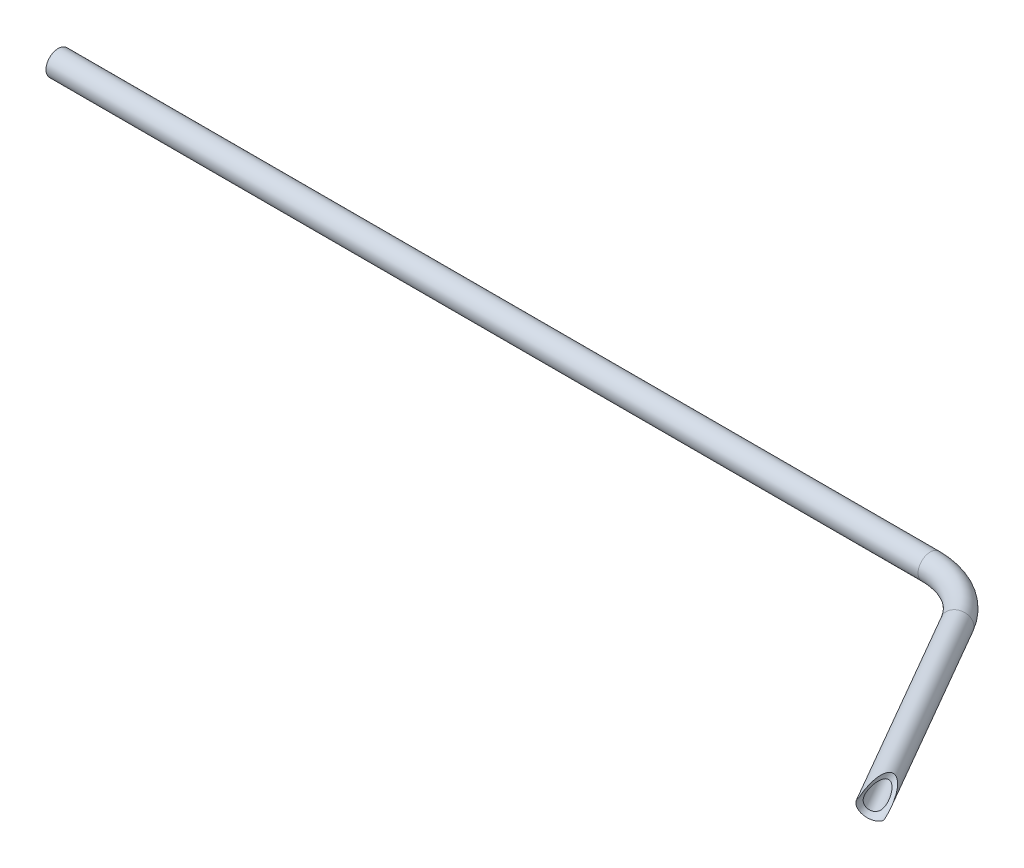
ISO-10303-21;
HEADER;
FILE_DESCRIPTION(('STEP AP214'),'2;1');
FILE_NAME('part.step','',(''),(''),'','','');
FILE_SCHEMA(('AUTOMOTIVE_DESIGN { 1 0 10303 214 1 1 1 1 }'));
ENDSEC;
DATA;
#1=APPLICATION_CONTEXT('core data for automotive mechanical design processes');
#2=APPLICATION_PROTOCOL_DEFINITION('international standard','automotive_design',2000,#1);
#3=PRODUCT_CONTEXT('',#1,'mechanical');
#4=PRODUCT('Part','Part','',(#3));
#5=PRODUCT_RELATED_PRODUCT_CATEGORY('part','',(#4));
#6=PRODUCT_DEFINITION_FORMATION('','',#4);
#7=PRODUCT_DEFINITION_CONTEXT('part definition',#1,'design');
#8=PRODUCT_DEFINITION('design','',#6,#7);
#9=PRODUCT_DEFINITION_SHAPE('','',#8);
#10=(LENGTH_UNIT() NAMED_UNIT(*) SI_UNIT(.MILLI.,.METRE.));
#11=(NAMED_UNIT(*) PLANE_ANGLE_UNIT() SI_UNIT($,.RADIAN.));
#12=(NAMED_UNIT(*) SI_UNIT($,.STERADIAN.) SOLID_ANGLE_UNIT());
#13=UNCERTAINTY_MEASURE_WITH_UNIT(LENGTH_MEASURE(1.E-05),#10,'distance_accuracy_value','');
#14=(GEOMETRIC_REPRESENTATION_CONTEXT(3) GLOBAL_UNCERTAINTY_ASSIGNED_CONTEXT((#13)) GLOBAL_UNIT_ASSIGNED_CONTEXT((#10,
#11,#12)) REPRESENTATION_CONTEXT('',''));
#15=CARTESIAN_POINT('',(0.,0.,0.));
#16=DIRECTION('',(0.,0.,1.));
#17=DIRECTION('',(1.,0.,0.));
#18=AXIS2_PLACEMENT_3D('',#15,#16,#17);
#19=CARTESIAN_POINT('',(0.,0.,0.));
#20=DIRECTION('',(1.,0.,0.));
#21=DIRECTION('',(0.,0.,-1.));
#22=AXIS2_PLACEMENT_3D('',#19,#20,#21);
#23=CYLINDRICAL_SURFACE('',#22,50.);
#24=CARTESIAN_POINT('',(3561.78262530607,0.,0.));
#25=DIRECTION('',(1.,0.,0.));
#26=DIRECTION('',(0.,0.,-1.));
#27=AXIS2_PLACEMENT_3D('',#24,#25,#26);
#28=CIRCLE('',#27,50.);
#29=CARTESIAN_POINT('',(3561.78262530607,0.,-49.9999999999999));
#30=VERTEX_POINT('',#29);
#31=EDGE_CURVE('E62',#30,#30,#28,.T.);
#32=ORIENTED_EDGE('',*,*,#31,.F.);
#33=EDGE_LOOP('',(#32));
#34=FACE_BOUND('',#33,.T.);
#35=CARTESIAN_POINT('',(0.,0.,0.));
#36=DIRECTION('',(1.,0.,0.));
#37=DIRECTION('',(0.,0.,-1.));
#38=AXIS2_PLACEMENT_3D('',#35,#36,#37);
#39=CIRCLE('',#38,50.);
#40=CARTESIAN_POINT('',(0.,0.,-50.));
#41=VERTEX_POINT('',#40);
#42=EDGE_CURVE('E71',#41,#41,#39,.T.);
#43=ORIENTED_EDGE('',*,*,#42,.T.);
#44=EDGE_LOOP('',(#43));
#45=FACE_BOUND('',#44,.T.);
#46=ADVANCED_FACE('F33',(#34,#45),#23,.T.);
#47=CARTESIAN_POINT('',(3561.78262530607,0.,300.));
#48=DIRECTION('',(0.,-1.,0.));
#49=DIRECTION('',(0.,0.,-1.));
#50=AXIS2_PLACEMENT_3D('',#47,#48,#49);
#51=TOROIDAL_SURFACE('',#50,300.,50.);
#52=CARTESIAN_POINT('',(3821.5902464414,0.,150.000000000001));
#53=DIRECTION('',(0.499999999999998,0.,0.86602540378444));
#54=DIRECTION('',(0.86602540378444,0.,-0.499999999999998));
#55=AXIS2_PLACEMENT_3D('',#52,#53,#54);
#56=CIRCLE('',#55,50.);
#57=CARTESIAN_POINT('',(3864.89151663063,0.,125.000000000001));
#58=VERTEX_POINT('',#57);
#59=EDGE_CURVE('E65',#58,#58,#56,.T.);
#60=CARTESIAN_POINT('',(3561.78262530607,0.,300.));
#61=DIRECTION('',(0.,-1.,0.));
#62=DIRECTION('',(0.,0.,-1.));
#63=AXIS2_PLACEMENT_3D('',#60,#61,#62);
#64=CIRCLE('',#63,350.);
#65=EDGE_CURVE('',#30,#58,#64,.T.);
#66=ORIENTED_EDGE('',*,*,#31,.T.);
#67=ORIENTED_EDGE('',*,*,#59,.F.);
#68=ORIENTED_EDGE('',*,*,#65,.T.);
#69=ORIENTED_EDGE('',*,*,#65,.F.);
#70=EDGE_LOOP('',(#66,#68,#67,#69));
#71=FACE_BOUND('',#70,.T.);
#72=ADVANCED_FACE('F78',(#71),#51,.T.);
#73=CARTESIAN_POINT('',(3821.5902464414,0.,150.000000000001));
#74=DIRECTION('',(0.499999999999998,0.,0.86602540378444));
#75=DIRECTION('',(0.86602540378444,0.,-0.499999999999998));
#76=AXIS2_PLACEMENT_3D('',#73,#74,#75);
#77=CYLINDRICAL_SURFACE('',#76,50.);
#78=CARTESIAN_POINT('',(4300.,-1.23165366794353E-13,978.630000000001));
#79=DIRECTION('',(0.710226827921264,0.703963727949918,-0.00359480621921086));
#80=DIRECTION('',(0.267094040751663,-0.264738685232534,0.926592791865066));
#81=AXIS2_PLACEMENT_3D('',#78,#79,#80);
#82=ELLIPSE('',#81,142.045365584253,50.);
#83=CARTESIAN_POINT('',(4332.56680158904,-32.9525605329934,959.827548335925));
#84=VERTEX_POINT('',#83);
#85=CARTESIAN_POINT('',(4267.43319841096,32.9525605329909,997.432451664075));
#86=VERTEX_POINT('',#85);
#87=EDGE_CURVE('E54',#84,#86,#82,.T.);
#88=ORIENTED_EDGE('',*,*,#87,.F.);
#89=CARTESIAN_POINT('',(4300.,-1.23165366794353E-13,978.630000000001));
#90=DIRECTION('',(0.267094040751663,-0.264738685232534,0.926592791865066));
#91=DIRECTION('',(0.710226827921264,0.703963727949918,-0.00359480621921086));
#92=AXIS2_PLACEMENT_3D('',#89,#90,#91);
#93=ELLIPSE('',#92,53.4188081503329,50.);
#94=EDGE_CURVE('E56',#86,#84,#93,.T.);
#95=ORIENTED_EDGE('',*,*,#94,.F.);
#96=EDGE_LOOP('',(#88,#95));
#97=FACE_BOUND('',#96,.T.);
#98=ORIENTED_EDGE('',*,*,#59,.T.);
#99=EDGE_LOOP('',(#98));
#100=FACE_BOUND('',#99,.T.);
#101=ADVANCED_FACE('F35',(#97,#100),#77,.T.);
#102=CARTESIAN_POINT('',(0.,0.,0.));
#103=DIRECTION('',(1.,0.,0.));
#104=DIRECTION('',(0.,0.,-1.));
#105=AXIS2_PLACEMENT_3D('',#102,#103,#104);
#106=PLANE('',#105);
#107=CARTESIAN_POINT('',(0.,0.,0.));
#108=DIRECTION('',(1.,0.,0.));
#109=DIRECTION('',(0.,0.,-1.));
#110=AXIS2_PLACEMENT_3D('',#107,#108,#109);
#111=CIRCLE('',#110,35.);
#112=CARTESIAN_POINT('',(0.,0.,-35.));
#113=VERTEX_POINT('',#112);
#114=EDGE_CURVE('E68',#113,#113,#111,.F.);
#115=ORIENTED_EDGE('',*,*,#114,.F.);
#116=EDGE_LOOP('',(#115));
#117=FACE_BOUND('',#116,.T.);
#118=ORIENTED_EDGE('',*,*,#42,.F.);
#119=EDGE_LOOP('',(#118));
#120=FACE_BOUND('',#119,.T.);
#121=ADVANCED_FACE('F88',(#117,#120),#106,.F.);
#122=CARTESIAN_POINT('',(0.,0.,0.));
#123=DIRECTION('',(1.,0.,0.));
#124=DIRECTION('',(0.,0.,-1.));
#125=AXIS2_PLACEMENT_3D('',#122,#123,#124);
#126=CYLINDRICAL_SURFACE('',#125,35.);
#127=CARTESIAN_POINT('',(3561.78262530607,0.,0.));
#128=DIRECTION('',(1.,0.,0.));
#129=DIRECTION('',(0.,0.,-1.));
#130=AXIS2_PLACEMENT_3D('',#127,#128,#129);
#131=CIRCLE('',#130,35.);
#132=CARTESIAN_POINT('',(3561.78262530607,0.,-35.));
#133=VERTEX_POINT('',#132);
#134=EDGE_CURVE('E47',#133,#133,#131,.F.);
#135=ORIENTED_EDGE('',*,*,#134,.F.);
#136=EDGE_LOOP('',(#135));
#137=FACE_BOUND('',#136,.T.);
#138=ORIENTED_EDGE('',*,*,#114,.T.);
#139=EDGE_LOOP('',(#138));
#140=FACE_BOUND('',#139,.T.);
#141=ADVANCED_FACE('F90',(#137,#140),#126,.F.);
#142=CARTESIAN_POINT('',(3561.78262530607,0.,300.));
#143=DIRECTION('',(0.,-1.,0.));
#144=DIRECTION('',(0.,0.,-1.));
#145=AXIS2_PLACEMENT_3D('',#142,#143,#144);
#146=TOROIDAL_SURFACE('',#145,300.,35.);
#147=CARTESIAN_POINT('',(3821.5902464414,0.,150.000000000001));
#148=DIRECTION('',(0.499999999999998,0.,0.86602540378444));
#149=DIRECTION('',(0.86602540378444,0.,-0.499999999999998));
#150=AXIS2_PLACEMENT_3D('',#147,#148,#149);
#151=CIRCLE('',#150,35.);
#152=CARTESIAN_POINT('',(3851.90113557386,0.,132.500000000001));
#153=VERTEX_POINT('',#152);
#154=EDGE_CURVE('E11',#153,#153,#151,.F.);
#155=CARTESIAN_POINT('',(3561.78262530607,0.,300.));
#156=DIRECTION('',(0.,-1.,0.));
#157=DIRECTION('',(0.,0.,-1.));
#158=AXIS2_PLACEMENT_3D('',#155,#156,#157);
#159=CIRCLE('',#158,335.);
#160=EDGE_CURVE('',#133,#153,#159,.T.);
#161=ORIENTED_EDGE('',*,*,#134,.T.);
#162=ORIENTED_EDGE('',*,*,#154,.F.);
#163=ORIENTED_EDGE('',*,*,#160,.T.);
#164=ORIENTED_EDGE('',*,*,#160,.F.);
#165=EDGE_LOOP('',(#161,#163,#162,#164));
#166=FACE_BOUND('',#165,.T.);
#167=ADVANCED_FACE('F97',(#166),#146,.F.);
#168=CARTESIAN_POINT('',(3821.5902464414,0.,150.000000000001));
#169=DIRECTION('',(0.499999999999998,0.,0.86602540378444));
#170=DIRECTION('',(0.86602540378444,0.,-0.499999999999998));
#171=AXIS2_PLACEMENT_3D('',#168,#169,#170);
#172=CYLINDRICAL_SURFACE('',#171,35.);
#173=CARTESIAN_POINT('',(4284.88946896214,0.,882.457792513082));
#174=CARTESIAN_POINT('',(4285.19683738173,-0.415963917673514,882.990171028531));
#175=CARTESIAN_POINT('',(4285.49871329565,-0.829186246528709,883.527852879587));
#176=CARTESIAN_POINT('',(4286.09158456451,-1.65060363470133,884.612975134687));
#177=CARTESIAN_POINT('',(4286.38257965562,-2.05879857195754,885.16041577488));
#178=CARTESIAN_POINT('',(4287.23936228283,-3.27654859534066,886.816313887177));
#179=CARTESIAN_POINT('',(4287.78891604266,-4.07922683551115,887.938293450928));
#180=CARTESIAN_POINT('',(4288.84465792513,-5.67003321300662,890.214348354848));
#181=CARTESIAN_POINT('',(4289.3508026254,-6.45814617653176,891.368454337775));
#182=CARTESIAN_POINT('',(4290.31741518861,-8.02182273900168,893.703890668888));
#183=CARTESIAN_POINT('',(4290.7778854766,-8.79738700237807,894.885219567585));
#184=CARTESIAN_POINT('',(4291.64839942914,-10.3354235823483,897.267202917483));
#185=CARTESIAN_POINT('',(4292.05864131131,-11.097936424329,898.467758767304));
#186=CARTESIAN_POINT('',(4292.8264918106,-12.6155128414943,900.89050862131));
#187=CARTESIAN_POINT('',(4293.18409578741,-13.3705757544595,902.112704522557));
#188=CARTESIAN_POINT('',(4293.67600604917,-14.4985177483642,903.959609074455));
#189=CARTESIAN_POINT('',(4293.83248736759,-14.8735209189809,904.577173799518));
#190=CARTESIAN_POINT('',(4294.12969440401,-15.6223310264893,905.816793563392));
#191=CARTESIAN_POINT('',(4294.27042067348,-15.9961380048057,906.438848444223));
#192=CARTESIAN_POINT('',(4294.53494542802,-16.7426548633127,907.687039557222));
#193=CARTESIAN_POINT('',(4294.65874714878,-17.1153649398431,908.313174985207));
#194=CARTESIAN_POINT('',(4294.88811280626,-17.8598553446211,909.569299179703));
#195=CARTESIAN_POINT('',(4294.99367775767,-18.2316357234619,910.199287729805));
#196=CARTESIAN_POINT('',(4295.16284105232,-18.8881754330785,911.316231509593));
#197=CARTESIAN_POINT('',(4295.2304939868,-19.1731161834971,911.80246763018));
#198=CARTESIAN_POINT('',(4295.35334826869,-19.7424493737099,912.776815932774));
#199=CARTESIAN_POINT('',(4295.40855003825,-20.0268418317692,913.264928050606));
#200=CARTESIAN_POINT('',(4295.50564058112,-20.5950247373555,914.242832351234));
#201=CARTESIAN_POINT('',(4295.5475294463,-20.8788151890236,914.732624522413));
#202=CARTESIAN_POINT('',(4295.61703835492,-21.4456690010128,915.713634927942));
#203=CARTESIAN_POINT('',(4295.64465825011,-21.7287323537495,916.204853177055));
#204=CARTESIAN_POINT('',(4295.7046107893,-22.5769752983459,917.680915992304));
#205=CARTESIAN_POINT('',(4295.71397476569,-23.1408617790182,918.66757312423));
#206=CARTESIAN_POINT('',(4295.66211310737,-24.2627315212162,920.642765096692));
#207=CARTESIAN_POINT('',(4295.6008850195,-24.8207145769108,921.631300001291));
#208=CARTESIAN_POINT('',(4295.4474639524,-25.6540920336222,923.11985319385));
#209=CARTESIAN_POINT('',(4295.38534088438,-25.9334113333718,923.620858244742));
#210=CARTESIAN_POINT('',(4295.23876626672,-26.4885025953554,924.621540959664));
#211=CARTESIAN_POINT('',(4295.15431706928,-26.7642749280743,925.121218757929));
#212=CARTESIAN_POINT('',(4294.9616694724,-27.3113417682666,926.118601296749));
#213=CARTESIAN_POINT('',(4294.85346618162,-27.5826353411046,926.616305609412));
#214=CARTESIAN_POINT('',(4294.61200869223,-28.1194314107043,927.608688819868));
#215=CARTESIAN_POINT('',(4294.47875795419,-28.3849347018047,928.10336812586));
#216=CARTESIAN_POINT('',(4294.18643728254,-28.9079937505313,929.087357902432));
#217=CARTESIAN_POINT('',(4294.02744309346,-29.165570262427,929.576679758668));
#218=CARTESIAN_POINT('',(4293.6824139432,-29.6719424596754,930.550348359788));
#219=CARTESIAN_POINT('',(4293.49637843128,-29.9207379660622,931.03469500313));
#220=CARTESIAN_POINT('',(4293.09669442081,-30.4076264960897,931.997109661792));
#221=CARTESIAN_POINT('',(4292.8830565567,-30.6457235941706,932.475180017457));
#222=CARTESIAN_POINT('',(4292.4279023901,-31.1093049295326,933.424024358798));
#223=CARTESIAN_POINT('',(4292.18638880896,-31.3347903948353,933.894799051629));
#224=CARTESIAN_POINT('',(4291.55737150505,-31.8720956157924,935.044003994489));
#225=CARTESIAN_POINT('',(4291.1540165277,-32.1755997230484,935.717749980799));
#226=CARTESIAN_POINT('',(4290.29030850535,-32.7446784405272,937.04421194585));
#227=CARTESIAN_POINT('',(4289.82996396376,-33.0102586966584,937.696931043737));
#228=CARTESIAN_POINT('',(4288.85648240192,-33.4975457529358,938.979442855372));
#229=CARTESIAN_POINT('',(4288.34332407384,-33.719234738746,939.609226175794));
#230=CARTESIAN_POINT('',(4287.27053682493,-34.1133065049343,940.844181129028));
#231=CARTESIAN_POINT('',(4286.71090544052,-34.2856866692457,941.449351454544));
#232=CARTESIAN_POINT('',(4285.55376258525,-34.5766080689368,942.633278005229));
#233=CARTESIAN_POINT('',(4284.95633490933,-34.6952639525635,943.212088084894));
#234=CARTESIAN_POINT('',(4283.73033658619,-34.8762478472124,944.344930344153));
#235=CARTESIAN_POINT('',(4283.10176597306,-34.9385759198753,944.898962550862));
#236=CARTESIAN_POINT('',(4281.82106121246,-35.0049536692425,945.983254724249));
#237=CARTESIAN_POINT('',(4281.16891704319,-35.0089782602181,946.513504360398));
#238=CARTESIAN_POINT('',(4279.84889207598,-34.9576316529484,947.551015040414));
#239=CARTESIAN_POINT('',(4279.18101066084,-34.9022581213502,948.058275180362));
#240=CARTESIAN_POINT('',(4277.80093973286,-34.7272636647771,949.077221590569));
#241=CARTESIAN_POINT('',(4277.08828044853,-34.6043877222867,949.587712940665));
#242=CARTESIAN_POINT('',(4275.6611163112,-34.2927447339436,950.58543841388));
#243=CARTESIAN_POINT('',(4274.94661141284,-34.1039760531557,951.072671959584));
#244=CARTESIAN_POINT('',(4273.52267067243,-33.6614398311434,952.024725310794));
#245=CARTESIAN_POINT('',(4272.8132355941,-33.4076627006663,952.489541797579));
#246=CARTESIAN_POINT('',(4271.40591765413,-32.8365290352426,953.397083497343));
#247=CARTESIAN_POINT('',(4270.70803523508,-32.5191700704117,953.839807865227));
#248=CARTESIAN_POINT('',(4269.27458508038,-31.7948709012419,954.737615494938));
#249=CARTESIAN_POINT('',(4268.54045464655,-31.382802832507,955.190865356469));
#250=CARTESIAN_POINT('',(4267.09899317672,-30.4894081027458,956.071003193042));
#251=CARTESIAN_POINT('',(4266.39166350449,-30.0080779232699,956.497889827281));
#252=CARTESIAN_POINT('',(4265.00955163797,-28.9793268536813,957.324202246759));
#253=CARTESIAN_POINT('',(4264.33477497751,-28.4318947816211,957.723623367883));
#254=CARTESIAN_POINT('',(4263.02305307496,-27.2747022122839,958.493210943404));
#255=CARTESIAN_POINT('',(4262.38610792358,-26.6649415655543,958.863377327652));
#256=CARTESIAN_POINT('',(4261.13946676427,-25.3716080984601,959.580861650852));
#257=CARTESIAN_POINT('',(4260.53081350188,-24.6865983047237,959.927402649021));
#258=CARTESIAN_POINT('',(4259.36186329109,-23.26032570063,960.584456784411));
#259=CARTESIAN_POINT('',(4258.80156740422,-22.5190616560522,960.894969130785));
#260=CARTESIAN_POINT('',(4257.73246883946,-20.9854883292057,961.476437697789));
#261=CARTESIAN_POINT('',(4257.22367198247,-20.1931732932037,961.74738944844));
#262=CARTESIAN_POINT('',(4256.25999119813,-18.5632944524712,962.24555827702));
#263=CARTESIAN_POINT('',(4255.80510700167,-17.725730873641,962.472775573265));
#264=CARTESIAN_POINT('',(4254.95064235136,-16.0113915824537,962.878784100743));
#265=CARTESIAN_POINT('',(4254.55106982521,-15.134610272885,963.057568393686));
#266=CARTESIAN_POINT('',(4253.80781576416,-13.348600339102,963.361357006035));
#267=CARTESIAN_POINT('',(4253.46413481443,-12.4393713752865,963.486360762388));
#268=CARTESIAN_POINT('',(4252.8321454263,-10.5956453837808,963.676728662446));
#269=CARTESIAN_POINT('',(4252.54384178877,-9.66114617331808,963.742087637152));
#270=CARTESIAN_POINT('',(4252.02105999276,-7.77493029321198,963.806836218701));
#271=CARTESIAN_POINT('',(4251.78658009259,-6.8232141817675,963.806227960487));
#272=CARTESIAN_POINT('',(4251.37437730485,-4.9375468848431,963.73356025383));
#273=CARTESIAN_POINT('',(4251.19527639092,-4.00382260741316,963.663457270362));
#274=CARTESIAN_POINT('',(4250.88163346843,-2.1373570453731,963.44896198415));
#275=CARTESIAN_POINT('',(4250.7470904316,-1.204615738574,963.304571395954));
#276=CARTESIAN_POINT('',(4250.51783854252,0.648944599800562,962.936858045086));
#277=CARTESIAN_POINT('',(4250.42307862546,1.56977743546017,962.713637149598));
#278=CARTESIAN_POINT('',(4250.2672383732,3.39045524597624,962.185019475864));
#279=CARTESIAN_POINT('',(4250.20615437963,4.2903024904167,961.879631629149));
#280=CARTESIAN_POINT('',(4250.11522071373,5.97976094668314,961.217045646419));
#281=CARTESIAN_POINT('',(4250.08306590364,6.77203287351613,960.866925332464));
#282=CARTESIAN_POINT('',(4250.0358349706,8.32386995236461,960.099659890693));
#283=CARTESIAN_POINT('',(4250.02075720641,9.08343824069371,959.682521208244));
#284=CARTESIAN_POINT('',(4250.00257394291,10.5643834402823,958.784875857773));
#285=CARTESIAN_POINT('',(4249.9994705151,11.285753722191,958.304358240381));
#286=CARTESIAN_POINT('',(4250.00067360725,12.6864264103097,957.285362437335));
#287=CARTESIAN_POINT('',(4250.00498114517,13.3657230239705,956.746876298608));
#288=CARTESIAN_POINT('',(4250.01504206481,14.4405782279171,955.824282057207));
#289=CARTESIAN_POINT('',(4250.01969717182,14.8493555538047,955.45539277764));
#290=CARTESIAN_POINT('',(4250.02974719998,15.649016836195,954.69864656816));
#291=CARTESIAN_POINT('',(4250.035142169,16.0398996321664,954.310788411403));
#292=CARTESIAN_POINT('',(4250.04605317781,16.8038944897913,953.51785452056));
#293=CARTESIAN_POINT('',(4250.05156923798,17.1770035225981,953.112775874011));
#294=CARTESIAN_POINT('',(4250.06225835149,17.9057435680447,952.287156241375));
#295=CARTESIAN_POINT('',(4250.06743136456,18.2613725281938,951.866613449594));
#296=CARTESIAN_POINT('',(4250.08190693704,19.3038348836183,950.582899673669));
#297=CARTESIAN_POINT('',(4250.09014754302,19.9651131984246,949.698829010692));
#298=CARTESIAN_POINT('',(4250.10232841479,21.2243611928009,947.887122045654));
#299=CARTESIAN_POINT('',(4250.10626865131,21.822330441477,946.959485447136));
#300=CARTESIAN_POINT('',(4250.10954820242,22.901246653177,945.168965542906));
#301=CARTESIAN_POINT('',(4250.10932667249,23.3878894681437,944.309493113794));
#302=CARTESIAN_POINT('',(4250.10578922888,24.3194827051429,942.568135229844));
#303=CARTESIAN_POINT('',(4250.10247273624,24.7644253094774,941.686245611607));
#304=CARTESIAN_POINT('',(4250.09349603315,25.6166505416695,939.903722719603));
#305=CARTESIAN_POINT('',(4250.08783404874,26.023904378764,939.003075749909));
#306=CARTESIAN_POINT('',(4250.0751060733,26.8037304804899,937.187011652009));
#307=CARTESIAN_POINT('',(4250.06804015631,27.1763045727855,936.271595305154));
#308=CARTESIAN_POINT('',(4250.05349838499,27.8917517608779,934.423209094585));
#309=CARTESIAN_POINT('',(4250.04602040476,28.2344415133873,933.490168513641));
#310=CARTESIAN_POINT('',(4250.03179488342,28.8901792141498,931.613749703954));
#311=CARTESIAN_POINT('',(4250.02504734465,29.2032270676512,930.670371442175));
#312=CARTESIAN_POINT('',(4250.0134113937,29.8015682709442,928.775369607505));
#313=CARTESIAN_POINT('',(4250.00852207927,30.0868750401161,927.823750266204));
#314=CARTESIAN_POINT('',(4250.00173484674,30.6315480655611,925.913074352606));
#315=CARTESIAN_POINT('',(4249.9998370485,30.8909132820345,924.954017483854));
#316=CARTESIAN_POINT('',(4250.00014918053,31.3341752322812,923.227339196293));
#317=CARTESIAN_POINT('',(4250.00159507295,31.5226272683816,922.460881692945));
#318=CARTESIAN_POINT('',(4250.00768977305,31.8844218281176,920.924405171264));
#319=CARTESIAN_POINT('',(4250.01233864028,32.0577640708119,920.154386086989));
#320=CARTESIAN_POINT('',(4250.02544031079,32.3897037063014,918.611147223689));
#321=CARTESIAN_POINT('',(4250.03389341513,32.5482999309499,917.837927196152));
#322=CARTESIAN_POINT('',(4250.05522321766,32.850970516386,916.2886952686));
#323=CARTESIAN_POINT('',(4250.06810000235,32.9950445931115,915.512683314281));
#324=CARTESIAN_POINT('',(4250.09894573709,33.2689984379653,913.9570195063));
#325=CARTESIAN_POINT('',(4250.11692253641,33.3988558954099,913.177363878255));
#326=CARTESIAN_POINT('',(4250.15864131344,33.64412376354,911.615937764337));
#327=CARTESIAN_POINT('',(4250.1823832752,33.7595342141747,910.834167284318));
#328=CARTESIAN_POINT('',(4250.23635495294,33.9757891357298,909.268879977708));
#329=CARTESIAN_POINT('',(4250.26658430164,34.0766344307281,908.485363252467));
#330=CARTESIAN_POINT('',(4250.33430844878,34.2635296701367,906.916897773657));
#331=CARTESIAN_POINT('',(4250.37180305114,34.3495800137381,906.131949059303));
#332=CARTESIAN_POINT('',(4250.45462849514,34.5060066454043,904.566150303434));
#333=CARTESIAN_POINT('',(4250.49990593452,34.5764827208131,903.785307440521));
#334=CARTESIAN_POINT('',(4250.59937174574,34.701983406434,902.22296881104));
#335=CARTESIAN_POINT('',(4250.653559798,34.7570085705986,901.441473068888));
#336=CARTESIAN_POINT('',(4250.77187140683,34.8509794508336,899.878040982486));
#337=CARTESIAN_POINT('',(4250.83599768757,34.8899207473779,899.096104576176));
#338=CARTESIAN_POINT('',(4250.97530302411,34.9508857006598,897.53255231933));
#339=CARTESIAN_POINT('',(4251.05048196902,34.9729095271033,896.750936465658));
#340=CARTESIAN_POINT('',(4251.2129645413,34.99899346462,895.190641284517));
#341=CARTESIAN_POINT('',(4251.30023715036,35.0030986854043,894.41195951951));
#342=CARTESIAN_POINT('',(4251.48849985673,34.9922328724991,892.856332624735));
#343=CARTESIAN_POINT('',(4251.58949054477,34.9772610170649,892.079387571221));
#344=CARTESIAN_POINT('',(4251.80678993793,34.9267462468729,890.52873231513));
#345=CARTESIAN_POINT('',(4251.92309010885,34.8912147557874,889.755020556285));
#346=CARTESIAN_POINT('',(4252.17296339188,34.7977680213227,888.211804129718));
#347=CARTESIAN_POINT('',(4252.30653396525,34.7398560653822,887.442298860938));
#348=CARTESIAN_POINT('',(4252.53565133233,34.627619516063,886.217012340666));
#349=CARTESIAN_POINT('',(4252.62493127679,34.5811910762983,885.759323554617));
#350=CARTESIAN_POINT('',(4252.81104072433,34.4789596876145,884.846542175684));
#351=CARTESIAN_POINT('',(4252.90786992965,34.4231571083223,884.391449481165));
#352=CARTESIAN_POINT('',(4253.10970964613,34.3015407795539,883.484276010847));
#353=CARTESIAN_POINT('',(4253.21472243373,34.2357242395847,883.032196111361));
#354=CARTESIAN_POINT('',(4253.43357005899,34.093393788492,882.131875853381));
#355=CARTESIAN_POINT('',(4253.54740505302,34.0168796877227,881.683635563105));
#356=CARTESIAN_POINT('',(4253.90264822874,33.7705481118606,880.34797573438));
#357=CARTESIAN_POINT('',(4254.15829488118,33.5836430796145,879.46732986167));
#358=CARTESIAN_POINT('',(4254.71401928855,33.157162603879,877.733336606532));
#359=CARTESIAN_POINT('',(4255.01406967194,32.9176195639627,876.879972798061));
#360=CARTESIAN_POINT('',(4255.53077699895,32.4895353177676,875.559250457207));
#361=CARTESIAN_POINT('',(4255.73036718681,32.3210826296995,875.078668091373));
#362=CARTESIAN_POINT('',(4256.14896018655,31.9613641526579,874.134630893192));
#363=CARTESIAN_POINT('',(4256.36796424762,31.7700968954093,873.671177165707));
#364=CARTESIAN_POINT('',(4256.82669236667,31.36309816308,872.766087363043));
#365=CARTESIAN_POINT('',(4257.0664030655,31.1473824336232,872.32443750565));
#366=CARTESIAN_POINT('',(4257.56782825982,30.6898386238649,871.468016711717));
#367=CARTESIAN_POINT('',(4257.8295345086,30.4480203205232,871.053235803671));
#368=CARTESIAN_POINT('',(4258.32428600524,29.9852081273084,870.331536080177));
#369=CARTESIAN_POINT('',(4258.55346858498,29.7688472705661,870.019000028905));
#370=CARTESIAN_POINT('',(4259.02665384174,29.3180912560135,869.419381794502));
#371=CARTESIAN_POINT('',(4259.2706491599,29.0837050378713,869.132287143851));
#372=CARTESIAN_POINT('',(4259.77279080052,28.5973539956103,868.587346261658));
#373=CARTESIAN_POINT('',(4260.03092486997,28.3454043423371,868.329475280903));
#374=CARTESIAN_POINT('',(4260.56040390233,27.8247045640463,867.846219580369));
#375=CARTESIAN_POINT('',(4260.83174882239,27.5559544934926,867.620834755283));
#376=CARTESIAN_POINT('',(4261.38741909176,27.001777671146,867.204415079122));
#377=CARTESIAN_POINT('',(4261.6718065274,26.7162688329657,867.013571940538));
#378=CARTESIAN_POINT('',(4262.2499159242,26.1321490941867,866.669872353674));
#379=CARTESIAN_POINT('',(4262.54363769849,25.8335384558237,866.517015145505));
#380=CARTESIAN_POINT('',(4263.13799134045,25.2257008150538,866.250190119678));
#381=CARTESIAN_POINT('',(4263.43862664499,24.9164684929428,866.136242111103));
#382=CARTESIAN_POINT('',(4264.04402677998,24.2903158683644,865.947093654371));
#383=CARTESIAN_POINT('',(4264.34879201957,23.9733948016988,865.871897074445));
#384=CARTESIAN_POINT('',(4265.00120815491,23.2914503112551,865.75133599541));
#385=CARTESIAN_POINT('',(4265.34909866657,22.9257047732309,865.711363683792));
#386=CARTESIAN_POINT('',(4266.04390238869,22.1912346378173,865.676494723274));
#387=CARTESIAN_POINT('',(4266.39081544198,21.8225095945364,865.681604950768));
#388=CARTESIAN_POINT('',(4267.08166622166,21.0844211094004,865.732983730371));
#389=CARTESIAN_POINT('',(4267.42559980102,20.7150574375631,865.779302496472));
#390=CARTESIAN_POINT('',(4268.10843955202,19.9781047124863,865.908962864211));
#391=CARTESIAN_POINT('',(4268.44734381322,19.6105163676726,865.992318180545));
#392=CARTESIAN_POINT('',(4269.3075188029,18.6730916627538,866.247989354821));
#393=CARTESIAN_POINT('',(4269.82433637849,18.105588637494,866.44397607175));
#394=CARTESIAN_POINT('',(4270.84053431097,16.9817673098664,866.902046688483));
#395=CARTESIAN_POINT('',(4271.33990381011,16.4254560602354,867.164170939366));
#396=CARTESIAN_POINT('',(4272.32134844598,15.3244287746901,867.743348443388));
#397=CARTESIAN_POINT('',(4272.80338899385,14.7797367257117,868.060504909757));
#398=CARTESIAN_POINT('',(4273.74932109269,13.7033383612357,868.739961073426));
#399=CARTESIAN_POINT('',(4274.21321534749,13.1716301155973,869.10225401138));
#400=CARTESIAN_POINT('',(4275.16635763647,12.0713426088899,869.900425458483));
#401=CARTESIAN_POINT('',(4275.65389550843,11.5039899841984,870.340019296301));
#402=CARTESIAN_POINT('',(4276.60929746648,10.3832130005681,871.256950657066));
#403=CARTESIAN_POINT('',(4277.07715606086,9.82979254662375,871.734298610056));
#404=CARTESIAN_POINT('',(4277.99461687609,8.73539744923635,872.72130461366));
#405=CARTESIAN_POINT('',(4278.44419860843,8.19443705275969,873.230997368994));
#406=CARTESIAN_POINT('',(4279.32548917329,7.1245730363704,874.277544541815));
#407=CARTESIAN_POINT('',(4279.75719952533,6.59566839313757,874.814396641407));
#408=CARTESIAN_POINT('',(4280.60555862829,5.54645011070952,875.91412968161));
#409=CARTESIAN_POINT('',(4281.02212963712,5.02618670389915,876.477118244473));
#410=CARTESIAN_POINT('',(4281.83883329697,3.9957557317781,877.623844093767));
#411=CARTESIAN_POINT('',(4282.23896578044,3.48558826939849,878.20758159157));
#412=CARTESIAN_POINT('',(4283.02312557197,2.47473446307066,879.393025283869));
#413=CARTESIAN_POINT('',(4283.40716199909,1.97404284133925,879.994720964234));
#414=CARTESIAN_POINT('',(4284.15981511391,0.98097301718201,881.214435730892));
#415=CARTESIAN_POINT('',(4284.52843106427,0.488595212957041,881.832455595437));
#416=CARTESIAN_POINT('',(4284.88946896214,0.,882.457792513082));
#417=B_SPLINE_CURVE_WITH_KNOTS('',3,(#173,#174,#175,#176,#177,#178,#179,#180,#181,#182,#183,
#184,#185,#186,#187,#188,#189,#190,#191,#192,#193,#194,#195,#196,#197,#198,#199,#200,#201,#202,
#203,#204,#205,#206,#207,#208,#209,#210,#211,#212,#213,#214,#215,#216,#217,#218,#219,#220,#221,
#222,#223,#224,#225,#226,#227,#228,#229,#230,#231,#232,#233,#234,#235,#236,#237,#238,#239,#240,
#241,#242,#243,#244,#245,#246,#247,#248,#249,#250,#251,#252,#253,#254,#255,#256,#257,#258,#259,
#260,#261,#262,#263,#264,#265,#266,#267,#268,#269,#270,#271,#272,#273,#274,#275,#276,#277,#278,
#279,#280,#281,#282,#283,#284,#285,#286,#287,#288,#289,#290,#291,#292,#293,#294,#295,#296,#297,
#298,#299,#300,#301,#302,#303,#304,#305,#306,#307,#308,#309,#310,#311,#312,#313,#314,#315,#316,
#317,#318,#319,#320,#321,#322,#323,#324,#325,#326,#327,#328,#329,#330,#331,#332,#333,#334,#335,
#336,#337,#338,#339,#340,#341,#342,#343,#344,#345,#346,#347,#348,#349,#350,#351,#352,#353,#354,
#355,#356,#357,#358,#359,#360,#361,#362,#363,#364,#365,#366,#367,#368,#369,#370,#371,#372,#373,
#374,#375,#376,#377,#378,#379,#380,#381,#382,#383,#384,#385,#386,#387,#388,#389,#390,#391,#392,
#393,#394,#395,#396,#397,#398,#399,#400,#401,#402,#403,#404,#405,#406,#407,#408,#409,#410,#411,
#412,#413,#414,#415,#416),.UNSPECIFIED.,.T.,.F.,(4,2,2,2,2,2,2,2,2,2,2,2,2,2,2,2,2,2,2,2,2,2,2,
2,2,2,2,2,2,2,2,2,2,2,2,2,2,2,2,2,2,2,2,2,2,2,2,2,2,2,2,2,2,2,2,2,2,2,2,2,2,2,2,2,2,2,2,2,2,2,2,
2,2,2,2,2,2,2,2,2,2,2,2,2,2,2,2,2,2,2,2,2,2,2,2,2,2,2,2,2,2,2,2,2,2,2,2,2,2,2,2,2,2,2,2,2,2,2,2,
2,2,4),(0.,2.22667997369954,4.45341390333335,8.9071073890618,13.36520520002,17.8230661849484,
22.2627255164328,26.7027759940098,28.920397388989,31.1379411369703,33.3550603324065,
35.5720561275405,37.2747930326838,38.9774721996421,40.6801396160726,42.3828247213693,
45.790266726507,49.1978271478911,50.9283423124724,52.6586752303258,54.3893647854648,
56.1198154035299,57.8452640997913,59.5707479421888,61.2955689733597,63.0202217615745,
65.5427028947091,68.0648081013928,70.5879348764981,73.111195490625,75.6290457602534,
78.146893274543,80.6658240888828,83.1848538587057,85.8376273936604,88.4904667540967,
91.1436976545603,93.797029971953,96.6621142981654,99.5273442193625,102.393059510223,
105.258781672708,108.194361351992,111.130005456645,114.065981005584,117.001941898218,
119.938323160896,122.874735165138,125.811401623701,128.747973040976,131.6041544675,
134.460269976732,137.312708141472,140.164836371901,142.761844648908,145.358603312787,
147.955811182793,150.553375835708,152.204715058043,153.856161225009,155.507887817317,
157.159807892473,160.468548451602,163.77731152922,166.73909304169,169.701428704595,
172.666008956532,175.630432882957,178.611923556881,181.593423760962,184.573474452812,
187.553644544409,189.921350155827,192.289099781374,194.65703681525,197.025020158437,
199.396667950802,201.76830918486,204.139816181864,206.511259181837,208.867036477581,
211.222729302233,213.579068994339,215.935385048749,218.285765693317,220.636247583908,
222.985424714707,225.334256908875,226.739981417462,228.145650510642,229.551712027784,
230.957798474658,233.762903437875,236.56628641247,238.206284813785,239.846388817335,
241.485442478517,243.12388433345,244.454271149474,245.784002363941,247.112598892164,
248.441191113546,249.776945105486,251.112672374162,252.449078665266,253.785618332809,
255.302441512489,256.819496055702,258.338401716795,259.857870300604,262.23053142717,
264.604643649931,266.983257635393,269.361515842268,271.963116714341,274.565438838587,
277.170601975772,279.775543150944,282.392374424498,285.009232363672,287.624587135208,
290.240066819171),.UNSPECIFIED.);
#418=CARTESIAN_POINT('',(4284.88946896214,0.,882.457792513082));
#419=VERTEX_POINT('',#418);
#420=EDGE_CURVE('E37',#419,#419,#417,.T.);
#421=ORIENTED_EDGE('',*,*,#420,.F.);
#422=EDGE_LOOP('',(#421));
#423=FACE_BOUND('',#422,.T.);
#424=ORIENTED_EDGE('',*,*,#154,.T.);
#425=EDGE_LOOP('',(#424));
#426=FACE_BOUND('',#425,.T.);
#427=ADVANCED_FACE('F101',(#423,#426),#172,.F.);
#428=CARTESIAN_POINT('',(4300.,-23.0417211778869,1019.01216534014));
#429=DIRECTION('',(0.,0.495590774858731,-0.868556148947737));
#430=DIRECTION('',(0.,0.868556148947737,0.495590774858731));
#431=AXIS2_PLACEMENT_3D('',#428,#429,#430);
#432=CYLINDRICAL_SURFACE('',#431,50.);
#433=ORIENTED_EDGE('',*,*,#87,.T.);
#434=ORIENTED_EDGE('',*,*,#94,.T.);
#435=EDGE_LOOP('',(#433,#434));
#436=FACE_BOUND('',#435,.T.);
#437=ORIENTED_EDGE('',*,*,#420,.T.);
#438=EDGE_LOOP('',(#437));
#439=FACE_BOUND('',#438,.T.);
#440=ADVANCED_FACE('F57',(#436,#439),#432,.F.);
#441=CLOSED_SHELL('',(#46,#72,#101,#121,#141,#167,#427,#440));
#442=MANIFOLD_SOLID_BREP('B2',#441);
#443=ADVANCED_BREP_SHAPE_REPRESENTATION('',(#18,#442),#14);
#444=SHAPE_DEFINITION_REPRESENTATION(#9,#443);
ENDSEC;
END-ISO-10303-21;
